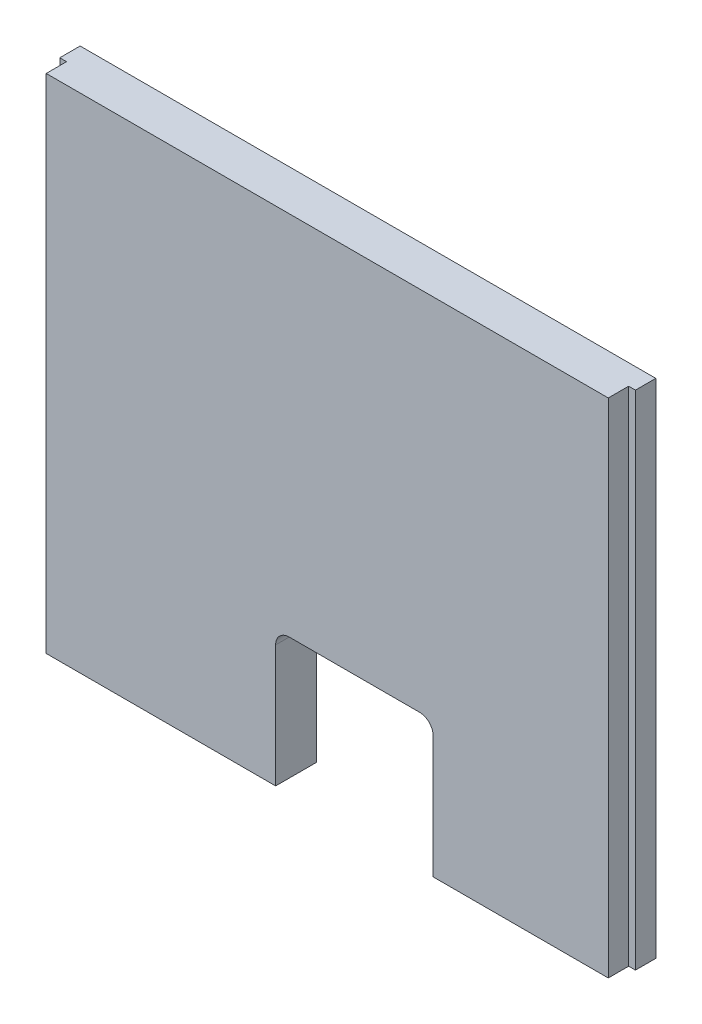
ISO-10303-21;
HEADER;
FILE_DESCRIPTION(('STEP AP214'),'2;1');
FILE_NAME('part.step','',(''),(''),'','','');
FILE_SCHEMA(('AUTOMOTIVE_DESIGN { 1 0 10303 214 1 1 1 1 }'));
ENDSEC;
DATA;
#1=APPLICATION_CONTEXT('core data for automotive mechanical design processes');
#2=APPLICATION_PROTOCOL_DEFINITION('international standard','automotive_design',2000,#1);
#3=PRODUCT_CONTEXT('',#1,'mechanical');
#4=PRODUCT('Part','Part','',(#3));
#5=PRODUCT_RELATED_PRODUCT_CATEGORY('part','',(#4));
#6=PRODUCT_DEFINITION_FORMATION('','',#4);
#7=PRODUCT_DEFINITION_CONTEXT('part definition',#1,'design');
#8=PRODUCT_DEFINITION('design','',#6,#7);
#9=PRODUCT_DEFINITION_SHAPE('','',#8);
#10=(LENGTH_UNIT() NAMED_UNIT(*) SI_UNIT(.MILLI.,.METRE.));
#11=(NAMED_UNIT(*) PLANE_ANGLE_UNIT() SI_UNIT($,.RADIAN.));
#12=(NAMED_UNIT(*) SI_UNIT($,.STERADIAN.) SOLID_ANGLE_UNIT());
#13=UNCERTAINTY_MEASURE_WITH_UNIT(LENGTH_MEASURE(1.E-05),#10,'distance_accuracy_value','');
#14=(GEOMETRIC_REPRESENTATION_CONTEXT(3) GLOBAL_UNCERTAINTY_ASSIGNED_CONTEXT((#13)) GLOBAL_UNIT_ASSIGNED_CONTEXT((#10,
#11,#12)) REPRESENTATION_CONTEXT('',''));
#15=CARTESIAN_POINT('',(0.,0.,0.));
#16=DIRECTION('',(0.,0.,1.));
#17=DIRECTION('',(1.,0.,0.));
#18=AXIS2_PLACEMENT_3D('',#15,#16,#17);
#19=CARTESIAN_POINT('',(-21.2,-18.5,1.5));
#20=DIRECTION('',(0.,1.,0.));
#21=DIRECTION('',(0.,0.,1.));
#22=AXIS2_PLACEMENT_3D('',#19,#20,#21);
#23=PLANE('',#22);
#24=DIRECTION('',(1.,0.,0.));
#25=VECTOR('',#24,1.);
#26=CARTESIAN_POINT('',(-20.7,-18.5,3.));
#27=LINE('',#26,#25);
#28=CARTESIAN_POINT('',(7.8,-18.5,3.));
#29=VERTEX_POINT('',#28);
#30=CARTESIAN_POINT('',(20.7,-18.5,3.));
#31=VERTEX_POINT('',#30);
#32=EDGE_CURVE('E137',#29,#31,#27,.T.);
#33=ORIENTED_EDGE('',*,*,#32,.F.);
#34=DIRECTION('',(0.,0.,-1.));
#35=VECTOR('',#34,1.);
#36=CARTESIAN_POINT('',(7.8,-18.5,3.));
#37=LINE('',#36,#35);
#38=CARTESIAN_POINT('',(7.8,-18.5,0.));
#39=VERTEX_POINT('',#38);
#40=EDGE_CURVE('E149',#29,#39,#37,.T.);
#41=ORIENTED_EDGE('',*,*,#40,.T.);
#42=DIRECTION('',(1.,0.,0.));
#43=VECTOR('',#42,1.);
#44=CARTESIAN_POINT('',(-21.2,-18.5,0.));
#45=LINE('',#44,#43);
#46=CARTESIAN_POINT('',(21.2,-18.5,0.));
#47=VERTEX_POINT('',#46);
#48=EDGE_CURVE('E207',#39,#47,#45,.T.);
#49=ORIENTED_EDGE('',*,*,#48,.T.);
#50=DIRECTION('',(0.,0.,-1.));
#51=VECTOR('',#50,1.);
#52=CARTESIAN_POINT('',(21.2,-18.5,1.5));
#53=LINE('',#52,#51);
#54=CARTESIAN_POINT('',(21.2,-18.5,1.5));
#55=VERTEX_POINT('',#54);
#56=EDGE_CURVE('E200',#55,#47,#53,.T.);
#57=ORIENTED_EDGE('',*,*,#56,.F.);
#58=DIRECTION('',(1.,0.,0.));
#59=VECTOR('',#58,1.);
#60=CARTESIAN_POINT('',(-21.2,-18.5,1.5));
#61=LINE('',#60,#59);
#62=CARTESIAN_POINT('',(20.7,-18.5,1.5));
#63=VERTEX_POINT('',#62);
#64=EDGE_CURVE('E197',#63,#55,#61,.T.);
#65=ORIENTED_EDGE('',*,*,#64,.F.);
#66=DIRECTION('',(0.,0.,-1.));
#67=VECTOR('',#66,1.);
#68=CARTESIAN_POINT('',(20.7,-18.5,3.));
#69=LINE('',#68,#67);
#70=EDGE_CURVE('E160',#31,#63,#69,.T.);
#71=ORIENTED_EDGE('',*,*,#70,.F.);
#72=EDGE_LOOP('',(#33,#41,#49,#57,#65,#71));
#73=FACE_BOUND('',#72,.T.);
#74=ADVANCED_FACE('F33',(#73),#23,.F.);
#75=CARTESIAN_POINT('',(0.,0.,1.5));
#76=DIRECTION('',(0.,0.,-1.));
#77=DIRECTION('',(-1.,0.,0.));
#78=AXIS2_PLACEMENT_3D('',#75,#76,#77);
#79=PLANE('',#78);
#80=DIRECTION('',(0.,1.,0.));
#81=VECTOR('',#80,1.);
#82=CARTESIAN_POINT('',(20.7,-18.5,1.5));
#83=LINE('',#82,#81);
#84=CARTESIAN_POINT('',(20.7,18.5,1.5));
#85=VERTEX_POINT('',#84);
#86=EDGE_CURVE('E170',#63,#85,#83,.T.);
#87=ORIENTED_EDGE('',*,*,#86,.F.);
#88=ORIENTED_EDGE('',*,*,#64,.T.);
#89=DIRECTION('',(0.,1.,0.));
#90=VECTOR('',#89,1.);
#91=CARTESIAN_POINT('',(21.2,-18.5,1.5));
#92=LINE('',#91,#90);
#93=CARTESIAN_POINT('',(21.2,18.5,1.5));
#94=VERTEX_POINT('',#93);
#95=EDGE_CURVE('E188',#55,#94,#92,.T.);
#96=ORIENTED_EDGE('',*,*,#95,.T.);
#97=DIRECTION('',(-1.,0.,0.));
#98=VECTOR('',#97,1.);
#99=CARTESIAN_POINT('',(-21.2,18.5,1.5));
#100=LINE('',#99,#98);
#101=EDGE_CURVE('E193',#94,#85,#100,.T.);
#102=ORIENTED_EDGE('',*,*,#101,.T.);
#103=EDGE_LOOP('',(#87,#88,#96,#102));
#104=FACE_BOUND('',#103,.T.);
#105=ADVANCED_FACE('F252',(#104),#79,.F.);
#106=DIRECTION('',(0.,-1.,0.));
#107=VECTOR('',#106,1.);
#108=CARTESIAN_POINT('',(-20.7,-18.5,1.5));
#109=LINE('',#108,#107);
#110=CARTESIAN_POINT('',(-20.7,18.5,1.5));
#111=VERTEX_POINT('',#110);
#112=CARTESIAN_POINT('',(-20.7,-18.5,1.5));
#113=VERTEX_POINT('',#112);
#114=EDGE_CURVE('E173',#111,#113,#109,.T.);
#115=ORIENTED_EDGE('',*,*,#114,.F.);
#116=CARTESIAN_POINT('',(-21.2,18.5,1.5));
#117=VERTEX_POINT('',#116);
#118=EDGE_CURVE('E191',#111,#117,#100,.T.);
#119=ORIENTED_EDGE('',*,*,#118,.T.);
#120=DIRECTION('',(0.,-1.,0.));
#121=VECTOR('',#120,1.);
#122=CARTESIAN_POINT('',(-21.2,-18.5,1.5));
#123=LINE('',#122,#121);
#124=CARTESIAN_POINT('',(-21.2,-18.5,1.5));
#125=VERTEX_POINT('',#124);
#126=EDGE_CURVE('E195',#117,#125,#123,.T.);
#127=ORIENTED_EDGE('',*,*,#126,.T.);
#128=EDGE_CURVE('E198',#125,#113,#61,.T.);
#129=ORIENTED_EDGE('',*,*,#128,.T.);
#130=EDGE_LOOP('',(#115,#119,#127,#129));
#131=FACE_BOUND('',#130,.T.);
#132=ADVANCED_FACE('F258',(#131),#79,.F.);
#133=CARTESIAN_POINT('',(21.2,-18.5,1.5));
#134=DIRECTION('',(-1.,0.,0.));
#135=DIRECTION('',(0.,0.,1.));
#136=AXIS2_PLACEMENT_3D('',#133,#134,#135);
#137=PLANE('',#136);
#138=DIRECTION('',(0.,1.,0.));
#139=VECTOR('',#138,1.);
#140=CARTESIAN_POINT('',(21.2,-18.5,0.));
#141=LINE('',#140,#139);
#142=CARTESIAN_POINT('',(21.2,18.5,0.));
#143=VERTEX_POINT('',#142);
#144=EDGE_CURVE('E187',#47,#143,#141,.T.);
#145=ORIENTED_EDGE('',*,*,#144,.T.);
#146=DIRECTION('',(0.,0.,-1.));
#147=VECTOR('',#146,1.);
#148=CARTESIAN_POINT('',(21.2,18.5,1.5));
#149=LINE('',#148,#147);
#150=EDGE_CURVE('E218',#94,#143,#149,.T.);
#151=ORIENTED_EDGE('',*,*,#150,.F.);
#152=ORIENTED_EDGE('',*,*,#95,.F.);
#153=ORIENTED_EDGE('',*,*,#56,.T.);
#154=EDGE_LOOP('',(#145,#151,#152,#153));
#155=FACE_BOUND('',#154,.T.);
#156=ADVANCED_FACE('F300',(#155),#137,.F.);
#157=CARTESIAN_POINT('',(-21.2,18.5,1.5));
#158=DIRECTION('',(0.,-1.,0.));
#159=DIRECTION('',(0.,0.,-1.));
#160=AXIS2_PLACEMENT_3D('',#157,#158,#159);
#161=PLANE('',#160);
#162=DIRECTION('',(-1.,0.,0.));
#163=VECTOR('',#162,1.);
#164=CARTESIAN_POINT('',(-21.2,18.5,0.));
#165=LINE('',#164,#163);
#166=CARTESIAN_POINT('',(-21.2,18.5,0.));
#167=VERTEX_POINT('',#166);
#168=EDGE_CURVE('E203',#143,#167,#165,.T.);
#169=ORIENTED_EDGE('',*,*,#168,.T.);
#170=DIRECTION('',(0.,0.,-1.));
#171=VECTOR('',#170,1.);
#172=CARTESIAN_POINT('',(-21.2,18.5,1.5));
#173=LINE('',#172,#171);
#174=EDGE_CURVE('E215',#117,#167,#173,.T.);
#175=ORIENTED_EDGE('',*,*,#174,.F.);
#176=ORIENTED_EDGE('',*,*,#118,.F.);
#177=DIRECTION('',(0.,0.,-1.));
#178=VECTOR('',#177,1.);
#179=CARTESIAN_POINT('',(-20.7,18.5,3.));
#180=LINE('',#179,#178);
#181=CARTESIAN_POINT('',(-20.7,18.5,3.));
#182=VERTEX_POINT('',#181);
#183=EDGE_CURVE('E181',#182,#111,#180,.T.);
#184=ORIENTED_EDGE('',*,*,#183,.F.);
#185=DIRECTION('',(-1.,0.,0.));
#186=VECTOR('',#185,1.);
#187=CARTESIAN_POINT('',(-20.7,18.5,3.));
#188=LINE('',#187,#186);
#189=CARTESIAN_POINT('',(20.7,18.5,3.));
#190=VERTEX_POINT('',#189);
#191=EDGE_CURVE('E166',#190,#182,#188,.T.);
#192=ORIENTED_EDGE('',*,*,#191,.F.);
#193=DIRECTION('',(0.,0.,-1.));
#194=VECTOR('',#193,1.);
#195=CARTESIAN_POINT('',(20.7,18.5,3.));
#196=LINE('',#195,#194);
#197=EDGE_CURVE('E184',#190,#85,#196,.T.);
#198=ORIENTED_EDGE('',*,*,#197,.T.);
#199=ORIENTED_EDGE('',*,*,#101,.F.);
#200=ORIENTED_EDGE('',*,*,#150,.T.);
#201=EDGE_LOOP('',(#169,#175,#176,#184,#192,#198,#199,#200));
#202=FACE_BOUND('',#201,.T.);
#203=ADVANCED_FACE('F271',(#202),#161,.F.);
#204=CARTESIAN_POINT('',(-21.2,-18.5,1.5));
#205=DIRECTION('',(1.,0.,0.));
#206=DIRECTION('',(0.,0.,-1.));
#207=AXIS2_PLACEMENT_3D('',#204,#205,#206);
#208=PLANE('',#207);
#209=DIRECTION('',(0.,-1.,0.));
#210=VECTOR('',#209,1.);
#211=CARTESIAN_POINT('',(-21.2,-18.5,0.));
#212=LINE('',#211,#210);
#213=CARTESIAN_POINT('',(-21.2,-18.5,0.));
#214=VERTEX_POINT('',#213);
#215=EDGE_CURVE('E205',#167,#214,#212,.T.);
#216=ORIENTED_EDGE('',*,*,#215,.T.);
#217=DIRECTION('',(0.,0.,-1.));
#218=VECTOR('',#217,1.);
#219=CARTESIAN_POINT('',(-21.2,-18.5,1.5));
#220=LINE('',#219,#218);
#221=EDGE_CURVE('E212',#125,#214,#220,.T.);
#222=ORIENTED_EDGE('',*,*,#221,.F.);
#223=ORIENTED_EDGE('',*,*,#126,.F.);
#224=ORIENTED_EDGE('',*,*,#174,.T.);
#225=EDGE_LOOP('',(#216,#222,#223,#224));
#226=FACE_BOUND('',#225,.T.);
#227=ADVANCED_FACE('F264',(#226),#208,.F.);
#228=CARTESIAN_POINT('',(-3.8,-18.5,0.));
#229=VERTEX_POINT('',#228);
#230=EDGE_CURVE('E192',#214,#229,#45,.T.);
#231=ORIENTED_EDGE('',*,*,#230,.T.);
#232=DIRECTION('',(0.,0.,-1.));
#233=VECTOR('',#232,1.);
#234=CARTESIAN_POINT('',(-3.8,-18.5,3.));
#235=LINE('',#234,#233);
#236=CARTESIAN_POINT('',(-3.8,-18.5,3.));
#237=VERTEX_POINT('',#236);
#238=EDGE_CURVE('E155',#237,#229,#235,.T.);
#239=ORIENTED_EDGE('',*,*,#238,.F.);
#240=CARTESIAN_POINT('',(-20.7,-18.5,3.));
#241=VERTEX_POINT('',#240);
#242=EDGE_CURVE('E162',#241,#237,#27,.T.);
#243=ORIENTED_EDGE('',*,*,#242,.F.);
#244=DIRECTION('',(0.,0.,-1.));
#245=VECTOR('',#244,1.);
#246=CARTESIAN_POINT('',(-20.7,-18.5,3.));
#247=LINE('',#246,#245);
#248=EDGE_CURVE('E178',#241,#113,#247,.T.);
#249=ORIENTED_EDGE('',*,*,#248,.T.);
#250=ORIENTED_EDGE('',*,*,#128,.F.);
#251=ORIENTED_EDGE('',*,*,#221,.T.);
#252=EDGE_LOOP('',(#231,#239,#243,#249,#250,#251));
#253=FACE_BOUND('',#252,.T.);
#254=ADVANCED_FACE('F254',(#253),#23,.F.);
#255=CARTESIAN_POINT('',(0.,0.,0.));
#256=DIRECTION('',(0.,0.,-1.));
#257=DIRECTION('',(-1.,0.,0.));
#258=AXIS2_PLACEMENT_3D('',#255,#256,#257);
#259=PLANE('',#258);
#260=DIRECTION('',(0.,-1.,0.));
#261=VECTOR('',#260,1.);
#262=CARTESIAN_POINT('',(7.8,-18.5,0.));
#263=LINE('',#262,#261);
#264=CARTESIAN_POINT('',(7.8,-9.5,0.));
#265=VERTEX_POINT('',#264);
#266=EDGE_CURVE('E152',#265,#39,#263,.T.);
#267=ORIENTED_EDGE('',*,*,#266,.F.);
#268=CARTESIAN_POINT('',(6.8,-9.5,0.));
#269=DIRECTION('',(0.,0.,-1.));
#270=DIRECTION('',(-1.,0.,0.));
#271=AXIS2_PLACEMENT_3D('',#268,#269,#270);
#272=CIRCLE('',#271,1.);
#273=CARTESIAN_POINT('',(6.8,-8.5,0.));
#274=VERTEX_POINT('',#273);
#275=EDGE_CURVE('E229',#265,#274,#272,.F.);
#276=ORIENTED_EDGE('',*,*,#275,.T.);
#277=DIRECTION('',(1.,0.,0.));
#278=VECTOR('',#277,1.);
#279=CARTESIAN_POINT('',(7.8,-8.5,0.));
#280=LINE('',#279,#278);
#281=CARTESIAN_POINT('',(-2.8,-8.5,0.));
#282=VERTEX_POINT('',#281);
#283=EDGE_CURVE('E146',#282,#274,#280,.T.);
#284=ORIENTED_EDGE('',*,*,#283,.F.);
#285=CARTESIAN_POINT('',(-2.8,-9.5,0.));
#286=DIRECTION('',(0.,0.,-1.));
#287=DIRECTION('',(-1.,0.,0.));
#288=AXIS2_PLACEMENT_3D('',#285,#286,#287);
#289=CIRCLE('',#288,1.);
#290=CARTESIAN_POINT('',(-3.8,-9.5,0.));
#291=VERTEX_POINT('',#290);
#292=EDGE_CURVE('E41',#282,#291,#289,.F.);
#293=ORIENTED_EDGE('',*,*,#292,.T.);
#294=DIRECTION('',(0.,1.,0.));
#295=VECTOR('',#294,1.);
#296=CARTESIAN_POINT('',(-3.8,-18.5,0.));
#297=LINE('',#296,#295);
#298=EDGE_CURVE('E239',#229,#291,#297,.T.);
#299=ORIENTED_EDGE('',*,*,#298,.F.);
#300=ORIENTED_EDGE('',*,*,#230,.F.);
#301=ORIENTED_EDGE('',*,*,#215,.F.);
#302=ORIENTED_EDGE('',*,*,#168,.F.);
#303=ORIENTED_EDGE('',*,*,#144,.F.);
#304=ORIENTED_EDGE('',*,*,#48,.F.);
#305=EDGE_LOOP('',(#267,#276,#284,#293,#299,#300,#301,#302,#303,#304));
#306=FACE_BOUND('',#305,.T.);
#307=ADVANCED_FACE('F232',(#306),#259,.T.);
#308=CARTESIAN_POINT('',(20.7,-18.5,3.));
#309=DIRECTION('',(-1.,0.,0.));
#310=DIRECTION('',(0.,0.,1.));
#311=AXIS2_PLACEMENT_3D('',#308,#309,#310);
#312=PLANE('',#311);
#313=ORIENTED_EDGE('',*,*,#86,.T.);
#314=ORIENTED_EDGE('',*,*,#197,.F.);
#315=DIRECTION('',(0.,1.,0.));
#316=VECTOR('',#315,1.);
#317=CARTESIAN_POINT('',(20.7,-18.5,3.));
#318=LINE('',#317,#316);
#319=EDGE_CURVE('E176',#31,#190,#318,.T.);
#320=ORIENTED_EDGE('',*,*,#319,.F.);
#321=ORIENTED_EDGE('',*,*,#70,.T.);
#322=EDGE_LOOP('',(#313,#314,#320,#321));
#323=FACE_BOUND('',#322,.T.);
#324=ADVANCED_FACE('F270',(#323),#312,.F.);
#325=CARTESIAN_POINT('',(-20.7,-18.5,3.));
#326=DIRECTION('',(1.,0.,0.));
#327=DIRECTION('',(0.,0.,-1.));
#328=AXIS2_PLACEMENT_3D('',#325,#326,#327);
#329=PLANE('',#328);
#330=ORIENTED_EDGE('',*,*,#114,.T.);
#331=ORIENTED_EDGE('',*,*,#248,.F.);
#332=DIRECTION('',(0.,-1.,0.));
#333=VECTOR('',#332,1.);
#334=CARTESIAN_POINT('',(-20.7,-18.5,3.));
#335=LINE('',#334,#333);
#336=EDGE_CURVE('E163',#182,#241,#335,.T.);
#337=ORIENTED_EDGE('',*,*,#336,.F.);
#338=ORIENTED_EDGE('',*,*,#183,.T.);
#339=EDGE_LOOP('',(#330,#331,#337,#338));
#340=FACE_BOUND('',#339,.T.);
#341=ADVANCED_FACE('F292',(#340),#329,.F.);
#342=CARTESIAN_POINT('',(0.,0.,3.));
#343=DIRECTION('',(0.,0.,-1.));
#344=DIRECTION('',(-1.,0.,0.));
#345=AXIS2_PLACEMENT_3D('',#342,#343,#344);
#346=PLANE('',#345);
#347=DIRECTION('',(0.,1.,0.));
#348=VECTOR('',#347,1.);
#349=CARTESIAN_POINT('',(-3.8,-18.5,3.));
#350=LINE('',#349,#348);
#351=CARTESIAN_POINT('',(-3.8,-9.5,3.));
#352=VERTEX_POINT('',#351);
#353=EDGE_CURVE('E145',#237,#352,#350,.T.);
#354=ORIENTED_EDGE('',*,*,#353,.T.);
#355=CARTESIAN_POINT('',(-2.8,-9.5,3.));
#356=DIRECTION('',(0.,0.,-1.));
#357=DIRECTION('',(-1.,0.,0.));
#358=AXIS2_PLACEMENT_3D('',#355,#356,#357);
#359=CIRCLE('',#358,1.);
#360=CARTESIAN_POINT('',(-2.8,-8.5,3.));
#361=VERTEX_POINT('',#360);
#362=EDGE_CURVE('E11',#352,#361,#359,.T.);
#363=ORIENTED_EDGE('',*,*,#362,.T.);
#364=DIRECTION('',(1.,0.,0.));
#365=VECTOR('',#364,1.);
#366=CARTESIAN_POINT('',(7.8,-8.5,3.));
#367=LINE('',#366,#365);
#368=CARTESIAN_POINT('',(6.8,-8.5,3.));
#369=VERTEX_POINT('',#368);
#370=EDGE_CURVE('E156',#361,#369,#367,.T.);
#371=ORIENTED_EDGE('',*,*,#370,.T.);
#372=CARTESIAN_POINT('',(6.8,-9.5,3.));
#373=DIRECTION('',(0.,0.,-1.));
#374=DIRECTION('',(-1.,0.,0.));
#375=AXIS2_PLACEMENT_3D('',#372,#373,#374);
#376=CIRCLE('',#375,1.);
#377=CARTESIAN_POINT('',(7.8,-9.5,3.));
#378=VERTEX_POINT('',#377);
#379=EDGE_CURVE('E141',#369,#378,#376,.T.);
#380=ORIENTED_EDGE('',*,*,#379,.T.);
#381=DIRECTION('',(0.,-1.,0.));
#382=VECTOR('',#381,1.);
#383=CARTESIAN_POINT('',(7.8,-18.5,3.));
#384=LINE('',#383,#382);
#385=EDGE_CURVE('E132',#378,#29,#384,.T.);
#386=ORIENTED_EDGE('',*,*,#385,.T.);
#387=ORIENTED_EDGE('',*,*,#32,.T.);
#388=ORIENTED_EDGE('',*,*,#319,.T.);
#389=ORIENTED_EDGE('',*,*,#191,.T.);
#390=ORIENTED_EDGE('',*,*,#336,.T.);
#391=ORIENTED_EDGE('',*,*,#242,.T.);
#392=EDGE_LOOP('',(#354,#363,#371,#380,#386,#387,#388,#389,#390,#391));
#393=FACE_BOUND('',#392,.T.);
#394=ADVANCED_FACE('F134',(#393),#346,.F.);
#395=CARTESIAN_POINT('',(7.8,-18.5,3.));
#396=DIRECTION('',(1.,0.,0.));
#397=DIRECTION('',(0.,0.,-1.));
#398=AXIS2_PLACEMENT_3D('',#395,#396,#397);
#399=PLANE('',#398);
#400=ORIENTED_EDGE('',*,*,#385,.F.);
#401=DIRECTION('',(0.,0.,-1.));
#402=VECTOR('',#401,1.);
#403=CARTESIAN_POINT('',(7.8,-9.5,0.));
#404=LINE('',#403,#402);
#405=EDGE_CURVE('E221',#378,#265,#404,.T.);
#406=ORIENTED_EDGE('',*,*,#405,.T.);
#407=ORIENTED_EDGE('',*,*,#266,.T.);
#408=ORIENTED_EDGE('',*,*,#40,.F.);
#409=EDGE_LOOP('',(#400,#406,#407,#408));
#410=FACE_BOUND('',#409,.T.);
#411=ADVANCED_FACE('F150',(#410),#399,.F.);
#412=CARTESIAN_POINT('',(7.8,-8.5,3.));
#413=DIRECTION('',(0.,1.,0.));
#414=DIRECTION('',(0.,0.,1.));
#415=AXIS2_PLACEMENT_3D('',#412,#413,#414);
#416=PLANE('',#415);
#417=ORIENTED_EDGE('',*,*,#283,.T.);
#418=DIRECTION('',(0.,0.,-1.));
#419=VECTOR('',#418,1.);
#420=CARTESIAN_POINT('',(6.8,-8.5,3.));
#421=LINE('',#420,#419);
#422=EDGE_CURVE('E226',#274,#369,#421,.F.);
#423=ORIENTED_EDGE('',*,*,#422,.T.);
#424=ORIENTED_EDGE('',*,*,#370,.F.);
#425=DIRECTION('',(0.,0.,-1.));
#426=VECTOR('',#425,1.);
#427=CARTESIAN_POINT('',(-2.8,-8.5,0.));
#428=LINE('',#427,#426);
#429=EDGE_CURVE('E223',#361,#282,#428,.T.);
#430=ORIENTED_EDGE('',*,*,#429,.T.);
#431=EDGE_LOOP('',(#417,#423,#424,#430));
#432=FACE_BOUND('',#431,.T.);
#433=ADVANCED_FACE('F236',(#432),#416,.F.);
#434=CARTESIAN_POINT('',(-3.8,-18.5,3.));
#435=DIRECTION('',(-1.,0.,0.));
#436=DIRECTION('',(0.,0.,1.));
#437=AXIS2_PLACEMENT_3D('',#434,#435,#436);
#438=PLANE('',#437);
#439=ORIENTED_EDGE('',*,*,#298,.T.);
#440=DIRECTION('',(0.,0.,-1.));
#441=VECTOR('',#440,1.);
#442=CARTESIAN_POINT('',(-3.8,-9.5,3.));
#443=LINE('',#442,#441);
#444=EDGE_CURVE('E48',#291,#352,#443,.F.);
#445=ORIENTED_EDGE('',*,*,#444,.T.);
#446=ORIENTED_EDGE('',*,*,#353,.F.);
#447=ORIENTED_EDGE('',*,*,#238,.T.);
#448=EDGE_LOOP('',(#439,#445,#446,#447));
#449=FACE_BOUND('',#448,.T.);
#450=ADVANCED_FACE('F243',(#449),#438,.F.);
#451=CARTESIAN_POINT('',(6.8,-9.5,3.));
#452=DIRECTION('',(0.,0.,1.));
#453=DIRECTION('',(1.,0.,0.));
#454=AXIS2_PLACEMENT_3D('',#451,#452,#453);
#455=CYLINDRICAL_SURFACE('',#454,1.);
#456=ORIENTED_EDGE('',*,*,#379,.F.);
#457=ORIENTED_EDGE('',*,*,#422,.F.);
#458=ORIENTED_EDGE('',*,*,#275,.F.);
#459=ORIENTED_EDGE('',*,*,#405,.F.);
#460=EDGE_LOOP('',(#456,#457,#458,#459));
#461=FACE_BOUND('',#460,.T.);
#462=ADVANCED_FACE('F241',(#461),#455,.F.);
#463=CARTESIAN_POINT('',(-2.8,-9.5,3.));
#464=DIRECTION('',(0.,0.,1.));
#465=DIRECTION('',(1.,0.,0.));
#466=AXIS2_PLACEMENT_3D('',#463,#464,#465);
#467=CYLINDRICAL_SURFACE('',#466,1.);
#468=ORIENTED_EDGE('',*,*,#362,.F.);
#469=ORIENTED_EDGE('',*,*,#444,.F.);
#470=ORIENTED_EDGE('',*,*,#292,.F.);
#471=ORIENTED_EDGE('',*,*,#429,.F.);
#472=EDGE_LOOP('',(#468,#469,#470,#471));
#473=FACE_BOUND('',#472,.T.);
#474=ADVANCED_FACE('F35',(#473),#467,.F.);
#475=CLOSED_SHELL('',(#74,#105,#132,#156,#203,#227,#254,#307,#324,#341,#394,#411,#433,#450,#462,#474));
#476=MANIFOLD_SOLID_BREP('B2',#475);
#477=ADVANCED_BREP_SHAPE_REPRESENTATION('',(#18,#476),#14);
#478=SHAPE_DEFINITION_REPRESENTATION(#9,#477);
ENDSEC;
END-ISO-10303-21;
